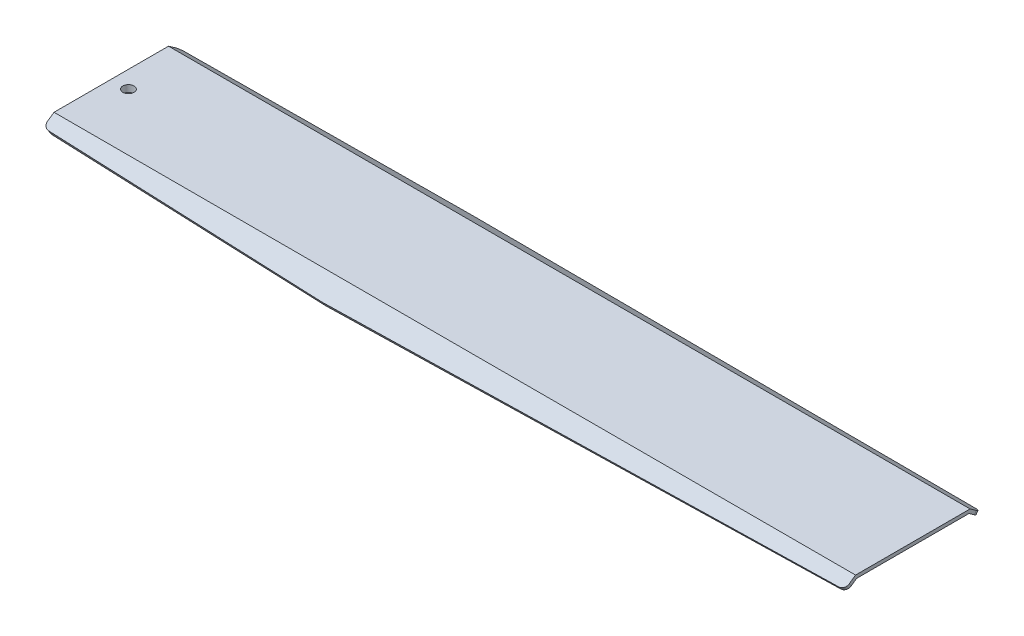
ISO-10303-21;
HEADER;
FILE_DESCRIPTION(('STEP AP214'),'2;1');
FILE_NAME('part.step','',(''),(''),'','','');
FILE_SCHEMA(('AUTOMOTIVE_DESIGN { 1 0 10303 214 1 1 1 1 }'));
ENDSEC;
DATA;
#1=APPLICATION_CONTEXT('core data for automotive mechanical design processes');
#2=APPLICATION_PROTOCOL_DEFINITION('international standard','automotive_design',2000,#1);
#3=PRODUCT_CONTEXT('',#1,'mechanical');
#4=PRODUCT('Part','Part','',(#3));
#5=PRODUCT_RELATED_PRODUCT_CATEGORY('part','',(#4));
#6=PRODUCT_DEFINITION_FORMATION('','',#4);
#7=PRODUCT_DEFINITION_CONTEXT('part definition',#1,'design');
#8=PRODUCT_DEFINITION('design','',#6,#7);
#9=PRODUCT_DEFINITION_SHAPE('','',#8);
#10=(LENGTH_UNIT() NAMED_UNIT(*) SI_UNIT(.MILLI.,.METRE.));
#11=(NAMED_UNIT(*) PLANE_ANGLE_UNIT() SI_UNIT($,.RADIAN.));
#12=(NAMED_UNIT(*) SI_UNIT($,.STERADIAN.) SOLID_ANGLE_UNIT());
#13=UNCERTAINTY_MEASURE_WITH_UNIT(LENGTH_MEASURE(1.E-05),#10,'distance_accuracy_value','');
#14=(GEOMETRIC_REPRESENTATION_CONTEXT(3) GLOBAL_UNCERTAINTY_ASSIGNED_CONTEXT((#13)) GLOBAL_UNIT_ASSIGNED_CONTEXT((#10,
#11,#12)) REPRESENTATION_CONTEXT('',''));
#15=CARTESIAN_POINT('',(0.,0.,0.));
#16=DIRECTION('',(0.,0.,1.));
#17=DIRECTION('',(1.,0.,0.));
#18=AXIS2_PLACEMENT_3D('',#15,#16,#17);
#19=CARTESIAN_POINT('',(177.8,3.048,25.4));
#20=DIRECTION('',(0.,0.819152044288991,0.573576436351047));
#21=DIRECTION('',(0.,-0.573576436351047,0.819152044288991));
#22=AXIS2_PLACEMENT_3D('',#19,#20,#21);
#23=PLANE('',#22);
#24=DIRECTION('',(0.999862784648941,0.00950151265767448,-0.0135695663630928));
#25=VECTOR('',#24,1.);
#26=CARTESIAN_POINT('',(-177.8,-3.71040315880013,35.052));
#27=LINE('',#26,#25);
#28=CARTESIAN_POINT('',(-50.8,-2.50354545187154,33.3284285714286));
#29=VERTEX_POINT('',#28);
#30=CARTESIAN_POINT('',(175.302076069763,-0.354938892364849,30.2599003961961));
#31=VERTEX_POINT('',#30);
#32=EDGE_CURVE('E161',#29,#31,#27,.T.);
#33=ORIENTED_EDGE('',*,*,#32,.T.);
#34=CARTESIAN_POINT('',(175.26,1.10174534909695,28.1795397002998));
#35=DIRECTION('',(0.,0.819152044288991,0.573576436351047));
#36=DIRECTION('',(0.,-0.573576436351047,0.819152044288991));
#37=AXIS2_PLACEMENT_3D('',#34,#35,#36);
#38=CIRCLE('',#37,2.54);
#39=CARTESIAN_POINT('',(177.8,1.10174534909694,28.1795397002998));
#40=VERTEX_POINT('',#39);
#41=EDGE_CURVE('E63',#31,#40,#38,.T.);
#42=ORIENTED_EDGE('',*,*,#41,.T.);
#43=DIRECTION('',(0.,0.573576436351047,-0.819152044288991));
#44=VECTOR('',#43,1.);
#45=CARTESIAN_POINT('',(177.8,3.048,25.4));
#46=LINE('',#45,#44);
#47=CARTESIAN_POINT('',(177.8,3.048,25.4));
#48=VERTEX_POINT('',#47);
#49=EDGE_CURVE('E194',#40,#48,#46,.T.);
#50=ORIENTED_EDGE('',*,*,#49,.T.);
#51=DIRECTION('',(-1.,0.,0.));
#52=VECTOR('',#51,1.);
#53=CARTESIAN_POINT('',(177.8,3.048,25.4));
#54=LINE('',#53,#52);
#55=CARTESIAN_POINT('',(-177.8,3.048,25.4));
#56=VERTEX_POINT('',#55);
#57=EDGE_CURVE('E197',#48,#56,#54,.T.);
#58=ORIENTED_EDGE('',*,*,#57,.T.);
#59=DIRECTION('',(0.,0.573576436351047,-0.819152044288991));
#60=VECTOR('',#59,1.);
#61=CARTESIAN_POINT('',(-177.8,3.048,25.4));
#62=LINE('',#61,#60);
#63=CARTESIAN_POINT('',(-177.8,1.08288337910475,28.2064773851473));
#64=VERTEX_POINT('',#63);
#65=EDGE_CURVE('E172',#64,#56,#62,.T.);
#66=ORIENTED_EDGE('',*,*,#65,.F.);
#67=CARTESIAN_POINT('',(-175.26,1.08288337910475,28.2064773851473));
#68=DIRECTION('',(0.,0.819152044288991,0.573576436351047));
#69=DIRECTION('',(0.,-0.573576436351047,0.819152044288991));
#70=AXIS2_PLACEMENT_3D('',#67,#68,#69);
#71=CIRCLE('',#70,2.54);
#72=CARTESIAN_POINT('',(-175.335713659214,-0.373353369419127,30.2861989948963));
#73=VERTEX_POINT('',#72);
#74=EDGE_CURVE('E265',#64,#73,#71,.T.);
#75=ORIENTED_EDGE('',*,*,#74,.T.);
#76=DIRECTION('',(0.999555627117971,-0.0170974688327882,0.0244177160338819));
#77=VECTOR('',#76,1.);
#78=CARTESIAN_POINT('',(-177.8,-0.331201579400066,30.226));
#79=LINE('',#78,#77);
#80=EDGE_CURVE('E173',#73,#29,#79,.T.);
#81=ORIENTED_EDGE('',*,*,#80,.T.);
#82=EDGE_LOOP('',(#33,#42,#50,#58,#66,#75,#81));
#83=FACE_BOUND('',#82,.T.);
#84=ADVANCED_FACE('F54',(#83),#23,.T.);
#85=CARTESIAN_POINT('',(177.8,-4.95879087429656,34.177869511001));
#86=DIRECTION('',(-0.00428567492765588,0.819144521567724,0.573571168884908));
#87=DIRECTION('',(0.,0.573576436351047,-0.819152044288991));
#88=AXIS2_PLACEMENT_3D('',#85,#86,#87);
#89=PLANE('',#88);
#90=DIRECTION('',(0.,0.573576436351048,-0.819152044288991));
#91=VECTOR('',#90,1.);
#92=CARTESIAN_POINT('',(177.8,-1.71739543714828,29.5486770783747));
#93=LINE('',#92,#91);
#94=CARTESIAN_POINT('',(177.8,-0.146642366399475,27.3054092113008));
#95=VERTEX_POINT('',#94);
#96=CARTESIAN_POINT('',(177.8,1.524,24.9194846457484));
#97=VERTEX_POINT('',#96);
#98=EDGE_CURVE('E190',#95,#97,#93,.T.);
#99=ORIENTED_EDGE('',*,*,#98,.F.);
#100=CARTESIAN_POINT('',(175.26,-0.15555942151016,27.2991654220936));
#101=DIRECTION('',(-0.00428567492765588,0.819144521567724,0.573571168884908));
#102=DIRECTION('',(-0.999990816453038,-0.00351061937819939,-0.00245816215228962));
#103=AXIS2_PLACEMENT_3D('',#100,#101,#102);
#104=ELLIPSE('',#103,2.5400233264235,2.54);
#105=CARTESIAN_POINT('',(175.302076069763,-1.61209594854955,29.379629548742));
#106=VERTEX_POINT('',#105);
#107=EDGE_CURVE('E12',#95,#106,#104,.F.);
#108=ORIENTED_EDGE('',*,*,#107,.T.);
#109=DIRECTION('',(-0.999853604881797,-0.0130115631001537,0.0111116169195636));
#110=VECTOR('',#109,1.);
#111=CARTESIAN_POINT('',(-177.963752189983,-6.20930957371137,33.3055588400193));
#112=LINE('',#111,#110);
#113=CARTESIAN_POINT('',(-50.8,-4.55446812732995,31.8923570537874));
#114=VERTEX_POINT('',#113);
#115=EDGE_CURVE('E153',#106,#114,#112,.T.);
#116=ORIENTED_EDGE('',*,*,#115,.T.);
#117=DIRECTION('',(-0.999546455808216,0.0135882525741636,-0.0268745618236998));
#118=VECTOR('',#117,1.);
#119=CARTESIAN_POINT('',(-177.963651598041,-2.82575226212291,28.473338961391));
#120=LINE('',#119,#118);
#121=CARTESIAN_POINT('',(-175.335713659214,-2.86147754958154,28.5439956879448));
#122=VERTEX_POINT('',#121);
#123=EDGE_CURVE('E157',#114,#122,#120,.T.);
#124=ORIENTED_EDGE('',*,*,#123,.T.);
#125=CARTESIAN_POINT('',(-175.26,-1.40497499677741,26.4644601963565));
#126=DIRECTION('',(-0.00428567492765588,0.819144521567724,0.573571168884908));
#127=DIRECTION('',(0.999990816453039,0.00351061937818453,0.00245816215231084));
#128=AXIS2_PLACEMENT_3D('',#125,#126,#127);
#129=ELLIPSE('',#128,2.5400233264235,2.54);
#130=CARTESIAN_POINT('',(-177.8,-1.41389205188809,26.4582164071494));
#131=VERTEX_POINT('',#130);
#132=EDGE_CURVE('E270',#122,#131,#129,.F.);
#133=ORIENTED_EDGE('',*,*,#132,.T.);
#134=DIRECTION('',(0.,-0.573576436351047,0.819152044288991));
#135=VECTOR('',#134,1.);
#136=CARTESIAN_POINT('',(-177.8,-6.20717858979298,33.303739022002));
#137=LINE('',#136,#135);
#138=CARTESIAN_POINT('',(-177.8,0.,24.4389692914969));
#139=VERTEX_POINT('',#138);
#140=EDGE_CURVE('E198',#139,#131,#137,.T.);
#141=ORIENTED_EDGE('',*,*,#140,.F.);
#142=DIRECTION('',(-0.999989903499915,-0.00428567101499963,-0.00135126688056317));
#143=VECTOR('',#142,1.);
#144=CARTESIAN_POINT('',(0.,0.762,24.6792269686226));
#145=LINE('',#144,#143);
#146=EDGE_CURVE('E185',#97,#139,#145,.T.);
#147=ORIENTED_EDGE('',*,*,#146,.F.);
#148=EDGE_LOOP('',(#99,#108,#116,#124,#133,#141,#147));
#149=FACE_BOUND('',#148,.T.);
#150=ADVANCED_FACE('F155',(#149),#89,.F.);
#151=CARTESIAN_POINT('',(177.8,0.,0.));
#152=DIRECTION('',(-1.,0.,0.));
#153=DIRECTION('',(0.,0.,1.));
#154=AXIS2_PLACEMENT_3D('',#151,#152,#153);
#155=PLANE('',#154);
#156=DIRECTION('',(0.,0.573576436351048,0.81915204428899));
#157=VECTOR('',#156,1.);
#158=CARTESIAN_POINT('',(177.8,-0.0277946474482441,-27.1356770783747));
#159=LINE('',#158,#157);
#160=CARTESIAN_POINT('',(177.8,-0.146642366399478,-27.3054092113008));
#161=VERTEX_POINT('',#160);
#162=CARTESIAN_POINT('',(177.8,1.524,-24.9194846457484));
#163=VERTEX_POINT('',#162);
#164=EDGE_CURVE('E251',#161,#163,#159,.T.);
#165=ORIENTED_EDGE('',*,*,#164,.F.);
#166=DIRECTION('',(0.,0.819152044288991,-0.573576436351047));
#167=VECTOR('',#166,1.);
#168=CARTESIAN_POINT('',(177.8,-12.8775896333124,-18.391103966458));
#169=LINE('',#168,#167);
#170=CARTESIAN_POINT('',(177.8,1.10174534909694,-28.1795397002998));
#171=VERTEX_POINT('',#170);
#172=EDGE_CURVE('E286',#161,#171,#169,.T.);
#173=ORIENTED_EDGE('',*,*,#172,.T.);
#174=DIRECTION('',(0.,0.573576436351047,0.819152044288991));
#175=VECTOR('',#174,1.);
#176=CARTESIAN_POINT('',(177.8,3.048,-25.4));
#177=LINE('',#176,#175);
#178=CARTESIAN_POINT('',(177.8,3.048,-25.4));
#179=VERTEX_POINT('',#178);
#180=EDGE_CURVE('E218',#171,#179,#177,.T.);
#181=ORIENTED_EDGE('',*,*,#180,.T.);
#182=DIRECTION('',(0.,0.,1.));
#183=VECTOR('',#182,1.);
#184=CARTESIAN_POINT('',(177.8,3.048,0.));
#185=LINE('',#184,#183);
#186=EDGE_CURVE('E231',#179,#48,#185,.T.);
#187=ORIENTED_EDGE('',*,*,#186,.T.);
#188=ORIENTED_EDGE('',*,*,#49,.F.);
#189=DIRECTION('',(0.,0.819152044288991,0.573576436351047));
#190=VECTOR('',#189,1.);
#191=CARTESIAN_POINT('',(177.8,-0.146642366399476,27.3054092113008));
#192=LINE('',#191,#190);
#193=EDGE_CURVE('E283',#40,#95,#192,.F.);
#194=ORIENTED_EDGE('',*,*,#193,.T.);
#195=ORIENTED_EDGE('',*,*,#98,.T.);
#196=DIRECTION('',(0.,0.,1.));
#197=VECTOR('',#196,1.);
#198=CARTESIAN_POINT('',(177.8,1.524,-12.4597423228742));
#199=LINE('',#198,#197);
#200=EDGE_CURVE('E241',#163,#97,#199,.T.);
#201=ORIENTED_EDGE('',*,*,#200,.F.);
#202=EDGE_LOOP('',(#165,#173,#181,#187,#188,#194,#195,#201));
#203=FACE_BOUND('',#202,.T.);
#204=ADVANCED_FACE('F306',(#203),#155,.F.);
#205=CARTESIAN_POINT('',(-177.8,0.,0.));
#206=DIRECTION('',(-1.,0.,0.));
#207=DIRECTION('',(0.,0.,1.));
#208=AXIS2_PLACEMENT_3D('',#205,#206,#207);
#209=PLANE('',#208);
#210=ORIENTED_EDGE('',*,*,#140,.T.);
#211=DIRECTION('',(0.,0.819152044288991,0.573576436351047));
#212=VECTOR('',#211,1.);
#213=CARTESIAN_POINT('',(-177.8,-12.8964516033046,18.4180416513056));
#214=LINE('',#213,#212);
#215=EDGE_CURVE('E261',#131,#64,#214,.T.);
#216=ORIENTED_EDGE('',*,*,#215,.T.);
#217=ORIENTED_EDGE('',*,*,#65,.T.);
#218=DIRECTION('',(0.,0.,1.));
#219=VECTOR('',#218,1.);
#220=CARTESIAN_POINT('',(-177.8,3.048,0.));
#221=LINE('',#220,#219);
#222=CARTESIAN_POINT('',(-177.8,3.048,-25.4));
#223=VERTEX_POINT('',#222);
#224=EDGE_CURVE('E224',#223,#56,#221,.T.);
#225=ORIENTED_EDGE('',*,*,#224,.F.);
#226=DIRECTION('',(0.,0.573576436351047,0.819152044288991));
#227=VECTOR('',#226,1.);
#228=CARTESIAN_POINT('',(-177.8,3.048,-25.4));
#229=LINE('',#228,#227);
#230=CARTESIAN_POINT('',(-177.8,1.08288337910475,-28.2064773851473));
#231=VERTEX_POINT('',#230);
#232=EDGE_CURVE('E228',#231,#223,#229,.T.);
#233=ORIENTED_EDGE('',*,*,#232,.F.);
#234=DIRECTION('',(0.,0.819152044288991,-0.573576436351047));
#235=VECTOR('',#234,1.);
#236=CARTESIAN_POINT('',(-177.8,-1.41389205188809,-26.4582164071493));
#237=LINE('',#236,#235);
#238=CARTESIAN_POINT('',(-177.8,-1.41389205188809,-26.4582164071493));
#239=VERTEX_POINT('',#238);
#240=EDGE_CURVE('E189',#231,#239,#237,.F.);
#241=ORIENTED_EDGE('',*,*,#240,.T.);
#242=DIRECTION('',(0.,0.573576436351048,0.81915204428899));
#243=VECTOR('',#242,1.);
#244=CARTESIAN_POINT('',(-177.8,-3.10358929489649,-28.8713541567494));
#245=LINE('',#244,#243);
#246=CARTESIAN_POINT('',(-177.8,0.,-24.4389692914969));
#247=VERTEX_POINT('',#246);
#248=EDGE_CURVE('E223',#239,#247,#245,.T.);
#249=ORIENTED_EDGE('',*,*,#248,.T.);
#250=DIRECTION('',(0.,0.,1.));
#251=VECTOR('',#250,1.);
#252=CARTESIAN_POINT('',(-177.8,0.,-12.2194846457484));
#253=LINE('',#252,#251);
#254=EDGE_CURVE('E245',#247,#139,#253,.T.);
#255=ORIENTED_EDGE('',*,*,#254,.T.);
#256=EDGE_LOOP('',(#210,#216,#217,#225,#233,#241,#249,#255));
#257=FACE_BOUND('',#256,.T.);
#258=ADVANCED_FACE('F338',(#257),#209,.T.);
#259=CARTESIAN_POINT('',(177.8,3.048,-25.4));
#260=DIRECTION('',(0.,-0.819152044288991,0.573576436351047));
#261=DIRECTION('',(0.,-0.573576436351047,-0.819152044288991));
#262=AXIS2_PLACEMENT_3D('',#259,#260,#261);
#263=PLANE('',#262);
#264=ORIENTED_EDGE('',*,*,#180,.F.);
#265=CARTESIAN_POINT('',(175.26,1.10174534909694,-28.1795397002998));
#266=DIRECTION('',(0.,-0.819152044288991,0.573576436351047));
#267=DIRECTION('',(0.,-0.573576436351047,-0.819152044288991));
#268=AXIS2_PLACEMENT_3D('',#265,#266,#267);
#269=CIRCLE('',#268,2.54);
#270=CARTESIAN_POINT('',(175.302076069763,-0.354938892364849,-30.2599003961961));
#271=VERTEX_POINT('',#270);
#272=EDGE_CURVE('E290',#171,#271,#269,.F.);
#273=ORIENTED_EDGE('',*,*,#272,.T.);
#274=DIRECTION('',(0.999862784648941,0.00950151265767448,0.0135695663630928));
#275=VECTOR('',#274,1.);
#276=CARTESIAN_POINT('',(-177.8,-3.71040315880013,-35.052));
#277=LINE('',#276,#275);
#278=CARTESIAN_POINT('',(-50.8,-2.50354545187154,-33.3284285714286));
#279=VERTEX_POINT('',#278);
#280=EDGE_CURVE('E237',#279,#271,#277,.T.);
#281=ORIENTED_EDGE('',*,*,#280,.F.);
#282=DIRECTION('',(0.999555627117971,-0.0170974688327882,-0.0244177160338819));
#283=VECTOR('',#282,1.);
#284=CARTESIAN_POINT('',(-177.8,-0.331201579400066,-30.226));
#285=LINE('',#284,#283);
#286=CARTESIAN_POINT('',(-175.335713659214,-0.373353369419127,-30.2861989948963));
#287=VERTEX_POINT('',#286);
#288=EDGE_CURVE('E207',#287,#279,#285,.T.);
#289=ORIENTED_EDGE('',*,*,#288,.F.);
#290=CARTESIAN_POINT('',(-175.26,1.08288337910475,-28.2064773851473));
#291=DIRECTION('',(0.,-0.819152044288991,0.573576436351047));
#292=DIRECTION('',(0.,-0.573576436351047,-0.819152044288991));
#293=AXIS2_PLACEMENT_3D('',#290,#291,#292);
#294=CIRCLE('',#293,2.54);
#295=EDGE_CURVE('E277',#287,#231,#294,.F.);
#296=ORIENTED_EDGE('',*,*,#295,.T.);
#297=ORIENTED_EDGE('',*,*,#232,.T.);
#298=DIRECTION('',(-1.,0.,0.));
#299=VECTOR('',#298,1.);
#300=CARTESIAN_POINT('',(177.8,3.048,-25.4));
#301=LINE('',#300,#299);
#302=EDGE_CURVE('E219',#179,#223,#301,.T.);
#303=ORIENTED_EDGE('',*,*,#302,.F.);
#304=EDGE_LOOP('',(#264,#273,#281,#289,#296,#297,#303));
#305=FACE_BOUND('',#304,.T.);
#306=ADVANCED_FACE('F334',(#305),#263,.F.);
#307=CARTESIAN_POINT('',(177.8,3.048,0.));
#308=DIRECTION('',(0.,-1.,0.));
#309=DIRECTION('',(0.,0.,-1.));
#310=AXIS2_PLACEMENT_3D('',#307,#308,#309);
#311=PLANE('',#310);
#312=CARTESIAN_POINT('',(-170.18,3.048,0.));
#313=DIRECTION('',(0.,1.,0.));
#314=DIRECTION('',(0.,0.,1.));
#315=AXIS2_PLACEMENT_3D('',#312,#313,#314);
#316=CIRCLE('',#315,2.4765);
#317=CARTESIAN_POINT('',(-170.18,3.048,2.4765));
#318=VERTEX_POINT('',#317);
#319=EDGE_CURVE('E162',#318,#318,#316,.T.);
#320=ORIENTED_EDGE('',*,*,#319,.F.);
#321=EDGE_LOOP('',(#320));
#322=FACE_BOUND('',#321,.T.);
#323=ORIENTED_EDGE('',*,*,#224,.T.);
#324=ORIENTED_EDGE('',*,*,#57,.F.);
#325=ORIENTED_EDGE('',*,*,#186,.F.);
#326=ORIENTED_EDGE('',*,*,#302,.T.);
#327=EDGE_LOOP('',(#323,#324,#325,#326));
#328=FACE_BOUND('',#327,.T.);
#329=ADVANCED_FACE('F337',(#322,#328),#311,.F.);
#330=CARTESIAN_POINT('',(-177.8,-21.8559583479525,-22.3463454715552));
#331=DIRECTION('',(-0.0165653817965759,0.573497732858973,0.819039644053663));
#332=DIRECTION('',(0.,-0.819152044288991,0.573576436351047));
#333=AXIS2_PLACEMENT_3D('',#330,#331,#332);
#334=PLANE('',#333);
#335=ORIENTED_EDGE('',*,*,#280,.T.);
#336=DIRECTION('',(0.,0.819152044288991,-0.573576436351047));
#337=VECTOR('',#336,1.);
#338=CARTESIAN_POINT('',(175.302076069763,-18.5004940815173,-17.5542458677512));
#339=LINE('',#338,#337);
#340=CARTESIAN_POINT('',(175.302076069763,-1.61209594854955,-29.379629548742));
#341=VERTEX_POINT('',#340);
#342=EDGE_CURVE('E293',#271,#341,#339,.F.);
#343=ORIENTED_EDGE('',*,*,#342,.T.);
#344=DIRECTION('',(-0.999853604881796,-0.0130115631001537,-0.0111116169195636));
#345=VECTOR('',#344,1.);
#346=CARTESIAN_POINT('',(0.,-3.89338394234473,-31.3278042665015));
#347=LINE('',#346,#345);
#348=CARTESIAN_POINT('',(-50.8000000000114,-4.55446812732994,-31.8923570537873));
#349=VERTEX_POINT('',#348);
#350=EDGE_CURVE('E242',#341,#349,#347,.T.);
#351=ORIENTED_EDGE('',*,*,#350,.T.);
#352=DIRECTION('',(0.,0.819152044288991,-0.573576436351047));
#353=VECTOR('',#352,1.);
#354=CARTESIAN_POINT('',(-50.8,-20.6491006410239,-20.6227740429837));
#355=LINE('',#354,#353);
#356=EDGE_CURVE('E210',#349,#279,#355,.T.);
#357=ORIENTED_EDGE('',*,*,#356,.T.);
#358=EDGE_LOOP('',(#335,#343,#351,#357));
#359=FACE_BOUND('',#358,.T.);
#360=ADVANCED_FACE('F342',(#359),#334,.F.);
#361=CARTESIAN_POINT('',(177.8,1.524,-24.9194846457484));
#362=DIRECTION('',(0.00428567492765588,-0.999990816453038,0.));
#363=DIRECTION('',(0.,0.,1.));
#364=AXIS2_PLACEMENT_3D('',#361,#362,#363);
#365=PLANE('',#364);
#366=CARTESIAN_POINT('',(-170.18,0.0326571428571404,0.));
#367=DIRECTION('',(0.00428567492765588,-0.999990816453038,0.));
#368=DIRECTION('',(0.999990816453038,0.00428567492765588,0.));
#369=AXIS2_PLACEMENT_3D('',#366,#367,#368);
#370=ELLIPSE('',#369,2.47652274326292,2.4765);
#371=CARTESIAN_POINT('',(-167.7035,0.0432707142857118,0.));
#372=VERTEX_POINT('',#371);
#373=EDGE_CURVE('E504',#372,#372,#370,.F.);
#374=ORIENTED_EDGE('',*,*,#373,.T.);
#375=EDGE_LOOP('',(#374));
#376=FACE_BOUND('',#375,.T.);
#377=ORIENTED_EDGE('',*,*,#200,.T.);
#378=ORIENTED_EDGE('',*,*,#146,.T.);
#379=ORIENTED_EDGE('',*,*,#254,.F.);
#380=DIRECTION('',(-0.999989903499915,-0.00428567101499963,0.00135126688056317));
#381=VECTOR('',#380,1.);
#382=CARTESIAN_POINT('',(0.,0.762,-24.6792269686226));
#383=LINE('',#382,#381);
#384=EDGE_CURVE('E193',#163,#247,#383,.T.);
#385=ORIENTED_EDGE('',*,*,#384,.F.);
#386=EDGE_LOOP('',(#377,#378,#379,#385));
#387=FACE_BOUND('',#386,.T.);
#388=ADVANCED_FACE('F349',(#376,#387),#365,.T.);
#389=CARTESIAN_POINT('',(177.8,-1.57958929489649,-29.351869511001));
#390=DIRECTION('',(0.00428567492765589,-0.819144521567724,0.573571168884907));
#391=DIRECTION('',(0.,0.573576436351046,0.819152044288991));
#392=AXIS2_PLACEMENT_3D('',#389,#390,#391);
#393=PLANE('',#392);
#394=ORIENTED_EDGE('',*,*,#350,.F.);
#395=CARTESIAN_POINT('',(175.26,-0.155559421510167,-27.2991654220936));
#396=DIRECTION('',(0.00428567492765589,-0.819144521567724,0.573571168884907));
#397=DIRECTION('',(0.999990816453039,0.00351061937812511,-0.00245816215239573));
#398=AXIS2_PLACEMENT_3D('',#395,#396,#397);
#399=ELLIPSE('',#398,2.5400233264235,2.54);
#400=EDGE_CURVE('E296',#341,#161,#399,.T.);
#401=ORIENTED_EDGE('',*,*,#400,.T.);
#402=ORIENTED_EDGE('',*,*,#164,.T.);
#403=ORIENTED_EDGE('',*,*,#384,.T.);
#404=ORIENTED_EDGE('',*,*,#248,.F.);
#405=CARTESIAN_POINT('',(-175.26,-1.40497499677741,-26.4644601963565));
#406=DIRECTION('',(0.00428567492765589,-0.819144521567724,0.573571168884907));
#407=DIRECTION('',(-0.999990816453039,-0.00351061937812511,0.00245816215239573));
#408=AXIS2_PLACEMENT_3D('',#405,#406,#407);
#409=ELLIPSE('',#408,2.5400233264235,2.54);
#410=CARTESIAN_POINT('',(-175.335713659214,-2.86147754958154,-28.5439956879448));
#411=VERTEX_POINT('',#410);
#412=EDGE_CURVE('E280',#239,#411,#409,.T.);
#413=ORIENTED_EDGE('',*,*,#412,.T.);
#414=DIRECTION('',(0.999546455808216,-0.0135882525741636,-0.0268745618236998));
#415=VECTOR('',#414,1.);
#416=CARTESIAN_POINT('',(-177.881798462515,-2.82686500788179,-28.4755397266864));
#417=LINE('',#416,#415);
#418=EDGE_CURVE('E214',#411,#349,#417,.T.);
#419=ORIENTED_EDGE('',*,*,#418,.T.);
#420=EDGE_LOOP('',(#394,#401,#402,#403,#404,#413,#419));
#421=FACE_BOUND('',#420,.T.);
#422=ADVANCED_FACE('F332',(#421),#393,.T.);
#423=CARTESIAN_POINT('',(-177.8,-18.4767567685525,-17.5203454715551));
#424=DIRECTION('',(0.0298085272497562,0.573321554536962,0.818788035334251));
#425=DIRECTION('',(0.,-0.819152044288991,0.573576436351047));
#426=AXIS2_PLACEMENT_3D('',#423,#424,#425);
#427=PLANE('',#426);
#428=ORIENTED_EDGE('',*,*,#418,.F.);
#429=DIRECTION('',(0.,0.819152044288991,-0.573576436351047));
#430=VECTOR('',#429,1.);
#431=CARTESIAN_POINT('',(-175.335713659214,-0.373353369419122,-30.2861989948963));
#432=LINE('',#431,#430);
#433=EDGE_CURVE('E273',#411,#287,#432,.T.);
#434=ORIENTED_EDGE('',*,*,#433,.T.);
#435=ORIENTED_EDGE('',*,*,#288,.T.);
#436=ORIENTED_EDGE('',*,*,#356,.F.);
#437=EDGE_LOOP('',(#428,#434,#435,#436));
#438=FACE_BOUND('',#437,.T.);
#439=ADVANCED_FACE('F329',(#438),#427,.F.);
#440=CARTESIAN_POINT('',(-177.8,-34.1359959640333,6.55562814425049));
#441=DIRECTION('',(-0.0298085272497562,-0.573321554536962,0.818788035334251));
#442=DIRECTION('',(0.,-0.819152044288991,-0.573576436351047));
#443=AXIS2_PLACEMENT_3D('',#440,#441,#442);
#444=PLANE('',#443);
#445=ORIENTED_EDGE('',*,*,#80,.F.);
#446=DIRECTION('',(0.,0.819152044288991,0.573576436351047));
#447=VECTOR('',#446,1.);
#448=CARTESIAN_POINT('',(-175.335713659214,-34.1781477540524,6.61582713914683));
#449=LINE('',#448,#447);
#450=EDGE_CURVE('E177',#73,#122,#449,.F.);
#451=ORIENTED_EDGE('',*,*,#450,.T.);
#452=ORIENTED_EDGE('',*,*,#123,.F.);
#453=DIRECTION('',(0.,0.819152044288991,0.573576436351047));
#454=VECTOR('',#453,1.);
#455=CARTESIAN_POINT('',(-50.8,-36.3083398365048,9.65805671567907));
#456=LINE('',#455,#454);
#457=EDGE_CURVE('E166',#114,#29,#456,.T.);
#458=ORIENTED_EDGE('',*,*,#457,.T.);
#459=EDGE_LOOP('',(#445,#451,#452,#458));
#460=FACE_BOUND('',#459,.T.);
#461=ADVANCED_FACE('F175',(#460),#444,.T.);
#462=CARTESIAN_POINT('',(-177.8,-37.5151975434334,11.3816281442505));
#463=DIRECTION('',(0.0165653817965759,-0.573497732858973,0.819039644053663));
#464=DIRECTION('',(0.,-0.819152044288991,-0.573576436351047));
#465=AXIS2_PLACEMENT_3D('',#462,#463,#464);
#466=PLANE('',#465);
#467=ORIENTED_EDGE('',*,*,#115,.F.);
#468=DIRECTION('',(0.,0.819152044288992,0.573576436351047));
#469=VECTOR('',#468,1.);
#470=CARTESIAN_POINT('',(175.302076069763,-0.354938892364846,30.2599003961961));
#471=LINE('',#470,#469);
#472=EDGE_CURVE('E299',#106,#31,#471,.T.);
#473=ORIENTED_EDGE('',*,*,#472,.T.);
#474=ORIENTED_EDGE('',*,*,#32,.F.);
#475=ORIENTED_EDGE('',*,*,#457,.F.);
#476=EDGE_LOOP('',(#467,#473,#474,#475));
#477=FACE_BOUND('',#476,.T.);
#478=ADVANCED_FACE('F167',(#477),#466,.T.);
#479=CARTESIAN_POINT('',(-175.26,-12.8964516033046,18.4180416513056));
#480=DIRECTION('',(0.,0.819152044288991,0.573576436351047));
#481=DIRECTION('',(0.,-0.573576436351047,0.819152044288991));
#482=AXIS2_PLACEMENT_3D('',#479,#480,#481);
#483=CYLINDRICAL_SURFACE('',#482,2.54);
#484=ORIENTED_EDGE('',*,*,#132,.F.);
#485=ORIENTED_EDGE('',*,*,#450,.F.);
#486=ORIENTED_EDGE('',*,*,#74,.F.);
#487=ORIENTED_EDGE('',*,*,#215,.F.);
#488=EDGE_LOOP('',(#484,#485,#486,#487));
#489=FACE_BOUND('',#488,.T.);
#490=ADVANCED_FACE('F359',(#489),#483,.T.);
#491=CARTESIAN_POINT('',(-175.26,-17.0626718100477,-15.5008228567025));
#492=DIRECTION('',(0.,-0.819152044288991,0.573576436351047));
#493=DIRECTION('',(0.,-0.573576436351047,-0.819152044288991));
#494=AXIS2_PLACEMENT_3D('',#491,#492,#493);
#495=CYLINDRICAL_SURFACE('',#494,2.54);
#496=ORIENTED_EDGE('',*,*,#412,.F.);
#497=ORIENTED_EDGE('',*,*,#240,.F.);
#498=ORIENTED_EDGE('',*,*,#295,.F.);
#499=ORIENTED_EDGE('',*,*,#433,.F.);
#500=EDGE_LOOP('',(#496,#497,#498,#499));
#501=FACE_BOUND('',#500,.T.);
#502=ADVANCED_FACE('F318',(#501),#495,.T.);
#503=CARTESIAN_POINT('',(175.26,-12.8775896333124,-18.391103966458));
#504=DIRECTION('',(0.,0.819152044288991,-0.573576436351047));
#505=DIRECTION('',(0.,0.573576436351047,0.819152044288991));
#506=AXIS2_PLACEMENT_3D('',#503,#504,#505);
#507=CYLINDRICAL_SURFACE('',#506,2.54);
#508=ORIENTED_EDGE('',*,*,#400,.F.);
#509=ORIENTED_EDGE('',*,*,#342,.F.);
#510=ORIENTED_EDGE('',*,*,#272,.F.);
#511=ORIENTED_EDGE('',*,*,#172,.F.);
#512=EDGE_LOOP('',(#508,#509,#510,#511));
#513=FACE_BOUND('',#512,.T.);
#514=ADVANCED_FACE('F311',(#513),#507,.T.);
#515=CARTESIAN_POINT('',(175.26,-32.7030490355363,4.50916784455025));
#516=DIRECTION('',(0.,-0.819152044288991,-0.573576436351047));
#517=DIRECTION('',(0.,0.573576436351047,-0.819152044288991));
#518=AXIS2_PLACEMENT_3D('',#515,#516,#517);
#519=CYLINDRICAL_SURFACE('',#518,2.54);
#520=ORIENTED_EDGE('',*,*,#107,.F.);
#521=ORIENTED_EDGE('',*,*,#193,.F.);
#522=ORIENTED_EDGE('',*,*,#41,.F.);
#523=ORIENTED_EDGE('',*,*,#472,.F.);
#524=EDGE_LOOP('',(#520,#521,#522,#523));
#525=FACE_BOUND('',#524,.T.);
#526=ADVANCED_FACE('F56',(#525),#519,.T.);
#527=CARTESIAN_POINT('',(-170.18,-4.55546812732995,0.));
#528=DIRECTION('',(0.,1.,0.));
#529=DIRECTION('',(0.,0.,1.));
#530=AXIS2_PLACEMENT_3D('',#527,#528,#529);
#531=CYLINDRICAL_SURFACE('',#530,2.4765);
#532=ORIENTED_EDGE('',*,*,#373,.F.);
#533=EDGE_LOOP('',(#532));
#534=FACE_BOUND('',#533,.T.);
#535=ORIENTED_EDGE('',*,*,#319,.T.);
#536=EDGE_LOOP('',(#535));
#537=FACE_BOUND('',#536,.T.);
#538=ADVANCED_FACE('F310',(#534,#537),#531,.F.);
#539=CLOSED_SHELL('',(#84,#150,#204,#258,#306,#329,#360,#388,#422,#439,#461,#478,#490,#502,#514,
#526,#538));
#540=MANIFOLD_SOLID_BREP('B2',#539);
#541=ADVANCED_BREP_SHAPE_REPRESENTATION('',(#18,#540),#14);
#542=SHAPE_DEFINITION_REPRESENTATION(#9,#541);
ENDSEC;
END-ISO-10303-21;
